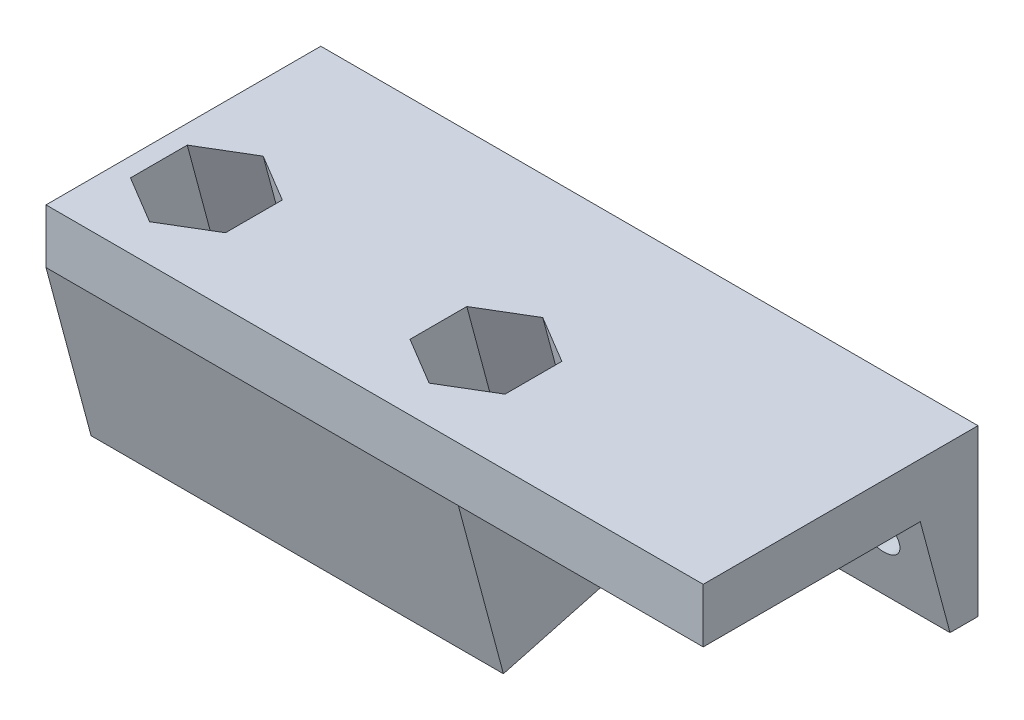
ISO-10303-21;
HEADER;
FILE_DESCRIPTION(('STEP AP214'),'2;1');
FILE_NAME('part.step','',(''),(''),'','','');
FILE_SCHEMA(('AUTOMOTIVE_DESIGN { 1 0 10303 214 1 1 1 1 }'));
ENDSEC;
DATA;
#1=APPLICATION_CONTEXT('core data for automotive mechanical design processes');
#2=APPLICATION_PROTOCOL_DEFINITION('international standard','automotive_design',2000,#1);
#3=PRODUCT_CONTEXT('',#1,'mechanical');
#4=PRODUCT('Part','Part','',(#3));
#5=PRODUCT_RELATED_PRODUCT_CATEGORY('part','',(#4));
#6=PRODUCT_DEFINITION_FORMATION('','',#4);
#7=PRODUCT_DEFINITION_CONTEXT('part definition',#1,'design');
#8=PRODUCT_DEFINITION('design','',#6,#7);
#9=PRODUCT_DEFINITION_SHAPE('','',#8);
#10=(LENGTH_UNIT() NAMED_UNIT(*) SI_UNIT(.MILLI.,.METRE.));
#11=(NAMED_UNIT(*) PLANE_ANGLE_UNIT() SI_UNIT($,.RADIAN.));
#12=(NAMED_UNIT(*) SI_UNIT($,.STERADIAN.) SOLID_ANGLE_UNIT());
#13=UNCERTAINTY_MEASURE_WITH_UNIT(LENGTH_MEASURE(1.E-05),#10,'distance_accuracy_value','');
#14=(GEOMETRIC_REPRESENTATION_CONTEXT(3) GLOBAL_UNCERTAINTY_ASSIGNED_CONTEXT((#13)) GLOBAL_UNIT_ASSIGNED_CONTEXT((#10,
#11,#12)) REPRESENTATION_CONTEXT('',''));
#15=CARTESIAN_POINT('',(0.,0.,0.));
#16=DIRECTION('',(0.,0.,1.));
#17=DIRECTION('',(1.,0.,0.));
#18=AXIS2_PLACEMENT_3D('',#15,#16,#17);
#19=CARTESIAN_POINT('',(-34.7500000000001,10.2662464495213,12.2025071457582));
#20=DIRECTION('',(0.,-0.965925826289068,-0.25881904510252));
#21=DIRECTION('',(0.,0.25881904510252,-0.965925826289068));
#22=AXIS2_PLACEMENT_3D('',#19,#20,#21);
#23=CYLINDRICAL_SURFACE('',#22,2.);
#24=CARTESIAN_POINT('',(-34.75,-0.975363448323253,9.190326852005));
#25=DIRECTION('',(0.,0.965925826289068,0.25881904510252));
#26=DIRECTION('',(0.,-0.25881904510252,0.965925826289068));
#27=AXIS2_PLACEMENT_3D('',#24,#25,#26);
#28=CIRCLE('',#27,2.);
#29=CARTESIAN_POINT('',(-34.75,-1.49300153852829,11.1221785045831));
#30=VERTEX_POINT('',#29);
#31=EDGE_CURVE('E381',#30,#30,#28,.T.);
#32=ORIENTED_EDGE('',*,*,#31,.F.);
#33=EDGE_LOOP('',(#32));
#34=FACE_BOUND('',#33,.T.);
#35=CARTESIAN_POINT('',(-34.7500000000001,3.33145055141853,10.3443341851869));
#36=DIRECTION('',(0.,0.965925826289068,0.25881904510252));
#37=DIRECTION('',(0.,-0.25881904510252,0.965925826289068));
#38=AXIS2_PLACEMENT_3D('',#35,#36,#37);
#39=CIRCLE('',#38,2.);
#40=CARTESIAN_POINT('',(-34.7500000000001,2.81381246121349,12.276185837765));
#41=VERTEX_POINT('',#40);
#42=EDGE_CURVE('E317',#41,#41,#39,.T.);
#43=ORIENTED_EDGE('',*,*,#42,.T.);
#44=EDGE_LOOP('',(#43));
#45=FACE_BOUND('',#44,.T.);
#46=ADVANCED_FACE('F39',(#34,#45),#23,.F.);
#47=CARTESIAN_POINT('',(-14.7500000000001,10.2662464495213,12.2025071457582));
#48=DIRECTION('',(0.,-0.965925826289068,-0.25881904510252));
#49=DIRECTION('',(0.,0.25881904510252,-0.965925826289068));
#50=AXIS2_PLACEMENT_3D('',#47,#48,#49);
#51=CYLINDRICAL_SURFACE('',#50,2.);
#52=CARTESIAN_POINT('',(-14.7500000000001,-0.975363448323243,9.190326852005));
#53=DIRECTION('',(0.,0.965925826289068,0.25881904510252));
#54=DIRECTION('',(0.,-0.25881904510252,0.965925826289068));
#55=AXIS2_PLACEMENT_3D('',#52,#53,#54);
#56=CIRCLE('',#55,2.);
#57=CARTESIAN_POINT('',(-14.7500000000001,-1.49300153852828,11.1221785045831));
#58=VERTEX_POINT('',#57);
#59=EDGE_CURVE('E384',#58,#58,#56,.T.);
#60=ORIENTED_EDGE('',*,*,#59,.F.);
#61=EDGE_LOOP('',(#60));
#62=FACE_BOUND('',#61,.T.);
#63=CARTESIAN_POINT('',(-14.7500000000001,3.33145055141854,10.3443341851869));
#64=DIRECTION('',(0.,0.965925826289068,0.25881904510252));
#65=DIRECTION('',(0.,-0.25881904510252,0.965925826289068));
#66=AXIS2_PLACEMENT_3D('',#63,#64,#65);
#67=CIRCLE('',#66,2.);
#68=CARTESIAN_POINT('',(-14.7500000000001,2.8138124612135,12.276185837765));
#69=VERTEX_POINT('',#68);
#70=EDGE_CURVE('E305',#69,#69,#67,.T.);
#71=ORIENTED_EDGE('',*,*,#70,.T.);
#72=EDGE_LOOP('',(#71));
#73=FACE_BOUND('',#72,.T.);
#74=ADVANCED_FACE('F537',(#62,#73),#51,.F.);
#75=CARTESIAN_POINT('',(-10.,12.2073892877902,4.95806344859015));
#76=DIRECTION('',(0.,-0.25881904510252,0.965925826289068));
#77=DIRECTION('',(0.,-0.965925826289068,-0.25881904510252));
#78=AXIS2_PLACEMENT_3D('',#75,#76,#77);
#79=PLANE('',#78);
#80=CARTESIAN_POINT('',(3.74999999999994,6.27312353150435,3.36798173152168));
#81=DIRECTION('',(0.,-0.25881904510252,0.965925826289068));
#82=DIRECTION('',(0.,0.965925826289068,0.25881904510252));
#83=AXIS2_PLACEMENT_3D('',#80,#81,#82);
#84=ELLIPSE('',#83,1.55291427061512,1.5);
#85=CARTESIAN_POINT('',(3.74999999999994,7.77312353150435,3.76990552016836));
#86=VERTEX_POINT('',#85);
#87=EDGE_CURVE('E230',#86,#86,#84,.T.);
#88=ORIENTED_EDGE('',*,*,#87,.F.);
#89=EDGE_LOOP('',(#88));
#90=FACE_BOUND('',#89,.T.);
#91=DIRECTION('',(0.,-0.965925826289068,-0.25881904510252));
#92=VECTOR('',#91,1.);
#93=CARTESIAN_POINT('',(7.51920912370846,-0.421775836808597,1.5740888523746));
#94=LINE('',#93,#92);
#95=CARTESIAN_POINT('',(7.51920912370846,9.11771432346218,4.13018753702379));
#96=VERTEX_POINT('',#95);
#97=CARTESIAN_POINT('',(7.51920912370846,1.17463517425132,2.00184589357625));
#98=VERTEX_POINT('',#97);
#99=EDGE_CURVE('E334',#96,#98,#94,.T.);
#100=ORIENTED_EDGE('',*,*,#99,.F.);
#101=DIRECTION('',(-1.,0.,0.));
#102=VECTOR('',#101,1.);
#103=CARTESIAN_POINT('',(23.5262830368964,9.11771432346221,4.1301875370238));
#104=LINE('',#103,#102);
#105=CARTESIAN_POINT('',(-10.,9.11771432346219,4.13018753702379));
#106=VERTEX_POINT('',#105);
#107=EDGE_CURVE('E319',#96,#106,#104,.T.);
#108=ORIENTED_EDGE('',*,*,#107,.T.);
#109=DIRECTION('',(0.,-0.965925826289068,-0.25881904510252));
#110=VECTOR('',#109,1.);
#111=CARTESIAN_POINT('',(-10.,12.2073892877902,4.95806344859015));
#112=LINE('',#111,#110);
#113=CARTESIAN_POINT('',(-10.,1.16774620563937,2.));
#114=VERTEX_POINT('',#113);
#115=EDGE_CURVE('E406',#106,#114,#112,.T.);
#116=ORIENTED_EDGE('',*,*,#115,.T.);
#117=DIRECTION('',(1.,0.,0.));
#118=VECTOR('',#117,1.);
#119=CARTESIAN_POINT('',(0.,1.16774620563937,2.));
#120=LINE('',#119,#118);
#121=CARTESIAN_POINT('',(0.,1.16774620563937,2.));
#122=VERTEX_POINT('',#121);
#123=EDGE_CURVE('E422',#114,#122,#120,.T.);
#124=ORIENTED_EDGE('',*,*,#123,.T.);
#125=DIRECTION('',(0.,0.965925826289068,0.25881904510252));
#126=VECTOR('',#125,1.);
#127=CARTESIAN_POINT('',(-5.99684705083167E-13,14.5521810124452,5.58634849763062));
#128=LINE('',#127,#126);
#129=CARTESIAN_POINT('',(0.,1.17463517425132,2.00184589357625));
#130=VERTEX_POINT('',#129);
#131=EDGE_CURVE('E409',#122,#130,#128,.T.);
#132=ORIENTED_EDGE('',*,*,#131,.T.);
#133=DIRECTION('',(-1.,0.,0.));
#134=VECTOR('',#133,1.);
#135=CARTESIAN_POINT('',(7.51920912370846,1.17463517425132,2.00184589357625));
#136=LINE('',#135,#134);
#137=EDGE_CURVE('E331',#98,#130,#136,.T.);
#138=ORIENTED_EDGE('',*,*,#137,.F.);
#139=EDGE_LOOP('',(#100,#108,#116,#124,#132,#138));
#140=FACE_BOUND('',#139,.T.);
#141=ADVANCED_FACE('F535',(#90,#140),#79,.T.);
#142=CARTESIAN_POINT('',(-10.,12.2073892877902,4.95806344859015));
#143=DIRECTION('',(-1.,0.,0.));
#144=DIRECTION('',(0.,-1.,0.));
#145=AXIS2_PLACEMENT_3D('',#142,#143,#144);
#146=PLANE('',#145);
#147=DIRECTION('',(0.,0.,-1.));
#148=VECTOR('',#147,1.);
#149=CARTESIAN_POINT('',(-10.,9.11771432346219,4.95806344859015));
#150=LINE('',#149,#148);
#151=CARTESIAN_POINT('',(-10.,9.11771432346219,19.659330243175));
#152=VERTEX_POINT('',#151);
#153=EDGE_CURVE('E313',#152,#106,#150,.T.);
#154=ORIENTED_EDGE('',*,*,#153,.F.);
#155=DIRECTION('',(0.,-0.965925826289068,-0.25881904510252));
#156=VECTOR('',#155,1.);
#157=CARTESIAN_POINT('',(-10.,8.32510361125244,19.4469508429262));
#158=LINE('',#157,#156);
#159=CARTESIAN_POINT('',(-10.,-2.91650628659214,16.434770549173));
#160=VERTEX_POINT('',#159);
#161=EDGE_CURVE('E396',#152,#160,#158,.T.);
#162=ORIENTED_EDGE('',*,*,#161,.T.);
#163=DIRECTION('',(0.,0.25881904510252,-0.965925826289068));
#164=VECTOR('',#163,1.);
#165=CARTESIAN_POINT('',(-10.,0.965779389945662,1.94588315483698));
#166=LINE('',#165,#164);
#167=CARTESIAN_POINT('',(-10.,0.965779389945662,1.94588315483698));
#168=VERTEX_POINT('',#167);
#169=EDGE_CURVE('E387',#160,#168,#166,.T.);
#170=ORIENTED_EDGE('',*,*,#169,.T.);
#171=EDGE_CURVE('E405',#114,#168,#112,.T.);
#172=ORIENTED_EDGE('',*,*,#171,.F.);
#173=ORIENTED_EDGE('',*,*,#115,.F.);
#174=EDGE_LOOP('',(#154,#162,#170,#172,#173));
#175=FACE_BOUND('',#174,.T.);
#176=ADVANCED_FACE('F528',(#175),#146,.F.);
#177=CARTESIAN_POINT('',(3.74999999999994,6.27312353150435,0.));
#178=DIRECTION('',(0.,0.,-1.));
#179=DIRECTION('',(-1.,0.,0.));
#180=AXIS2_PLACEMENT_3D('',#177,#178,#179);
#181=PLANE('',#180);
#182=CARTESIAN_POINT('',(3.74999999999994,6.27312353150435,0.));
#183=DIRECTION('',(0.,0.,-1.));
#184=DIRECTION('',(-1.,0.,0.));
#185=AXIS2_PLACEMENT_3D('',#182,#183,#184);
#186=CIRCLE('',#185,1.5);
#187=CARTESIAN_POINT('',(2.24999999999994,6.27312353150435,0.));
#188=VERTEX_POINT('',#187);
#189=EDGE_CURVE('E43',#188,#188,#186,.T.);
#190=ORIENTED_EDGE('',*,*,#189,.F.);
#191=EDGE_LOOP('',(#190));
#192=FACE_BOUND('',#191,.T.);
#193=DIRECTION('',(0.,-1.,0.));
#194=VECTOR('',#193,1.);
#195=CARTESIAN_POINT('',(-29.5000000000001,1.16774620563936,0.));
#196=LINE('',#195,#194);
#197=CARTESIAN_POINT('',(-29.5000000000001,1.1746351742513,0.));
#198=VERTEX_POINT('',#197);
#199=CARTESIAN_POINT('',(-29.5000000000001,1.16774620563936,0.));
#200=VERTEX_POINT('',#199);
#201=EDGE_CURVE('E425',#198,#200,#196,.T.);
#202=ORIENTED_EDGE('',*,*,#201,.F.);
#203=DIRECTION('',(-1.,0.,0.));
#204=VECTOR('',#203,1.);
#205=CARTESIAN_POINT('',(7.51920912370846,1.17463517425132,0.));
#206=LINE('',#205,#204);
#207=CARTESIAN_POINT('',(-39.5,1.1746351742513,0.));
#208=VERTEX_POINT('',#207);
#209=EDGE_CURVE('E330',#198,#208,#206,.T.);
#210=ORIENTED_EDGE('',*,*,#209,.T.);
#211=DIRECTION('',(0.,-1.,0.));
#212=VECTOR('',#211,1.);
#213=CARTESIAN_POINT('',(-39.5,0.,0.));
#214=LINE('',#213,#212);
#215=CARTESIAN_POINT('',(-39.5000000000001,13.,0.));
#216=VERTEX_POINT('',#215);
#217=EDGE_CURVE('E342',#216,#208,#214,.T.);
#218=ORIENTED_EDGE('',*,*,#217,.F.);
#219=DIRECTION('',(-1.,0.,0.));
#220=VECTOR('',#219,1.);
#221=CARTESIAN_POINT('',(-29.5000000000001,13.,0.));
#222=LINE('',#221,#220);
#223=CARTESIAN_POINT('',(7.51920912370845,13.,0.));
#224=VERTEX_POINT('',#223);
#225=EDGE_CURVE('E418',#224,#216,#222,.T.);
#226=ORIENTED_EDGE('',*,*,#225,.F.);
#227=DIRECTION('',(0.,-1.,0.));
#228=VECTOR('',#227,1.);
#229=CARTESIAN_POINT('',(7.51920912370846,0.,0.));
#230=LINE('',#229,#228);
#231=CARTESIAN_POINT('',(7.51920912370846,1.17463517425132,0.));
#232=VERTEX_POINT('',#231);
#233=EDGE_CURVE('E325',#224,#232,#230,.T.);
#234=ORIENTED_EDGE('',*,*,#233,.T.);
#235=CARTESIAN_POINT('',(0.,1.17463517425132,0.));
#236=VERTEX_POINT('',#235);
#237=EDGE_CURVE('E326',#232,#236,#206,.T.);
#238=ORIENTED_EDGE('',*,*,#237,.T.);
#239=DIRECTION('',(0.,1.,0.));
#240=VECTOR('',#239,1.);
#241=CARTESIAN_POINT('',(0.,2.52312353150435,0.));
#242=LINE('',#241,#240);
#243=CARTESIAN_POINT('',(0.,1.16774620563937,0.));
#244=VERTEX_POINT('',#243);
#245=EDGE_CURVE('E431',#244,#236,#242,.T.);
#246=ORIENTED_EDGE('',*,*,#245,.F.);
#247=DIRECTION('',(1.,0.,0.));
#248=VECTOR('',#247,1.);
#249=CARTESIAN_POINT('',(0.,1.16774620563937,0.));
#250=LINE('',#249,#248);
#251=EDGE_CURVE('E428',#200,#244,#250,.T.);
#252=ORIENTED_EDGE('',*,*,#251,.F.);
#253=EDGE_LOOP('',(#202,#210,#218,#226,#234,#238,#246,#252));
#254=FACE_BOUND('',#253,.T.);
#255=CARTESIAN_POINT('',(-33.2500000000001,6.27312353150437,0.));
#256=DIRECTION('',(0.,0.,1.));
#257=DIRECTION('',(1.,0.,0.));
#258=AXIS2_PLACEMENT_3D('',#255,#256,#257);
#259=CIRCLE('',#258,1.5);
#260=CARTESIAN_POINT('',(-31.7500000000001,6.27312353150437,0.));
#261=VERTEX_POINT('',#260);
#262=EDGE_CURVE('E415',#261,#261,#259,.T.);
#263=ORIENTED_EDGE('',*,*,#262,.T.);
#264=EDGE_LOOP('',(#263));
#265=FACE_BOUND('',#264,.T.);
#266=ADVANCED_FACE('F472',(#192,#254,#265),#181,.T.);
#267=CARTESIAN_POINT('',(-29.5000000000001,13.,2.));
#268=DIRECTION('',(0.,-1.,0.));
#269=DIRECTION('',(1.,0.,0.));
#270=AXIS2_PLACEMENT_3D('',#267,#268,#269);
#271=PLANE('',#270);
#272=DIRECTION('',(0.,0.,1.));
#273=VECTOR('',#272,1.);
#274=CARTESIAN_POINT('',(-11.3500000000001,13.,2.));
#275=LINE('',#274,#273);
#276=CARTESIAN_POINT('',(-11.3500000000001,13.,10.9027764650004));
#277=VERTEX_POINT('',#276);
#278=CARTESIAN_POINT('',(-11.3500000000001,13.,14.9672519388289));
#279=VERTEX_POINT('',#278);
#280=EDGE_CURVE('E287',#277,#279,#275,.T.);
#281=ORIENTED_EDGE('',*,*,#280,.T.);
#282=DIRECTION('',(-0.858356263574049,0.,0.513054114868206));
#283=VECTOR('',#282,1.);
#284=CARTESIAN_POINT('',(-19.0119148019403,13.,19.5469085263362));
#285=LINE('',#284,#283);
#286=CARTESIAN_POINT('',(-14.7500000000001,13.,16.9994896757431));
#287=VERTEX_POINT('',#286);
#288=EDGE_CURVE('E302',#279,#287,#285,.T.);
#289=ORIENTED_EDGE('',*,*,#288,.T.);
#290=DIRECTION('',(-0.858356263574048,0.,-0.513054114868206));
#291=VECTOR('',#290,1.);
#292=CARTESIAN_POINT('',(-32.2229617169554,13.,6.55560374137409));
#293=LINE('',#292,#291);
#294=CARTESIAN_POINT('',(-18.1500000000001,13.,14.9672519388289));
#295=VERTEX_POINT('',#294);
#296=EDGE_CURVE('E299',#287,#295,#293,.T.);
#297=ORIENTED_EDGE('',*,*,#296,.T.);
#298=DIRECTION('',(0.,0.,-1.));
#299=VECTOR('',#298,1.);
#300=CARTESIAN_POINT('',(-18.1500000000001,13.,2.));
#301=LINE('',#300,#299);
#302=CARTESIAN_POINT('',(-18.1500000000001,13.,10.9027764650004));
#303=VERTEX_POINT('',#302);
#304=EDGE_CURVE('E296',#295,#303,#301,.T.);
#305=ORIENTED_EDGE('',*,*,#304,.T.);
#306=DIRECTION('',(0.858356263574049,0.,-0.513054114868206));
#307=VECTOR('',#306,1.);
#308=CARTESIAN_POINT('',(-22.5917683389919,13.,13.5576968288622));
#309=LINE('',#308,#307);
#310=CARTESIAN_POINT('',(-14.7500000000001,13.,8.87053872808612));
#311=VERTEX_POINT('',#310);
#312=EDGE_CURVE('E293',#303,#311,#309,.T.);
#313=ORIENTED_EDGE('',*,*,#312,.T.);
#314=DIRECTION('',(0.858356263574049,0.,0.513054114868206));
#315=VECTOR('',#314,1.);
#316=CARTESIAN_POINT('',(-28.6431081799039,13.,0.566392043900022));
#317=LINE('',#316,#315);
#318=EDGE_CURVE('E290',#311,#277,#317,.T.);
#319=ORIENTED_EDGE('',*,*,#318,.T.);
#320=EDGE_LOOP('',(#281,#289,#297,#305,#313,#319));
#321=FACE_BOUND('',#320,.T.);
#322=DIRECTION('',(0.858356263574049,0.,0.513054114868206));
#323=VECTOR('',#322,1.);
#324=CARTESIAN_POINT('',(-33.9075986755679,13.,9.37405630489131));
#325=LINE('',#324,#323);
#326=CARTESIAN_POINT('',(-34.7500000000001,13.,8.87053872808613));
#327=VERTEX_POINT('',#326);
#328=CARTESIAN_POINT('',(-31.3500000000001,13.,10.9027764650004));
#329=VERTEX_POINT('',#328);
#330=EDGE_CURVE('E253',#327,#329,#325,.T.);
#331=ORIENTED_EDGE('',*,*,#330,.T.);
#332=DIRECTION('',(0.,0.,1.));
#333=VECTOR('',#332,1.);
#334=CARTESIAN_POINT('',(-31.3500000000001,13.,2.));
#335=LINE('',#334,#333);
#336=CARTESIAN_POINT('',(-31.3500000000001,13.,14.9672519388289));
#337=VERTEX_POINT('',#336);
#338=EDGE_CURVE('E284',#329,#337,#335,.T.);
#339=ORIENTED_EDGE('',*,*,#338,.T.);
#340=DIRECTION('',(-0.858356263574049,0.,0.513054114868206));
#341=VECTOR('',#340,1.);
#342=CARTESIAN_POINT('',(-24.2764052976043,13.,10.739244265345));
#343=LINE('',#342,#341);
#344=CARTESIAN_POINT('',(-34.7500000000001,13.,16.9994896757431));
#345=VERTEX_POINT('',#344);
#346=EDGE_CURVE('E281',#337,#345,#343,.T.);
#347=ORIENTED_EDGE('',*,*,#346,.T.);
#348=DIRECTION('',(-0.858356263574048,0.,-0.513054114868207));
#349=VECTOR('',#348,1.);
#350=CARTESIAN_POINT('',(-37.4874522126194,13.,15.3632680023654));
#351=LINE('',#350,#349);
#352=CARTESIAN_POINT('',(-38.1500000000001,13.,14.9672519388289));
#353=VERTEX_POINT('',#352);
#354=EDGE_CURVE('E278',#345,#353,#351,.T.);
#355=ORIENTED_EDGE('',*,*,#354,.T.);
#356=DIRECTION('',(0.,0.,-1.));
#357=VECTOR('',#356,1.);
#358=CARTESIAN_POINT('',(-38.1500000000001,13.,2.));
#359=LINE('',#358,#357);
#360=CARTESIAN_POINT('',(-38.1500000000001,13.,10.9027764650004));
#361=VERTEX_POINT('',#360);
#362=EDGE_CURVE('E275',#353,#361,#359,.T.);
#363=ORIENTED_EDGE('',*,*,#362,.T.);
#364=DIRECTION('',(0.858356263574049,0.,-0.513054114868205));
#365=VECTOR('',#364,1.);
#366=CARTESIAN_POINT('',(-27.8562588346558,13.,4.75003256787089));
#367=LINE('',#366,#365);
#368=EDGE_CURVE('E272',#361,#327,#367,.T.);
#369=ORIENTED_EDGE('',*,*,#368,.T.);
#370=EDGE_LOOP('',(#331,#339,#347,#355,#363,#369));
#371=FACE_BOUND('',#370,.T.);
#372=ORIENTED_EDGE('',*,*,#225,.T.);
#373=DIRECTION('',(0.,0.,-1.));
#374=VECTOR('',#373,1.);
#375=CARTESIAN_POINT('',(-39.5000000000001,13.,0.));
#376=LINE('',#375,#374);
#377=CARTESIAN_POINT('',(-39.5000000000001,13.,19.659330243175));
#378=VERTEX_POINT('',#377);
#379=EDGE_CURVE('E336',#378,#216,#376,.T.);
#380=ORIENTED_EDGE('',*,*,#379,.F.);
#381=DIRECTION('',(-1.,0.,0.));
#382=VECTOR('',#381,1.);
#383=CARTESIAN_POINT('',(23.5262830368964,13.,19.659330243175));
#384=LINE('',#383,#382);
#385=CARTESIAN_POINT('',(7.51920912370846,13.,19.659330243175));
#386=VERTEX_POINT('',#385);
#387=EDGE_CURVE('E316',#386,#378,#384,.T.);
#388=ORIENTED_EDGE('',*,*,#387,.F.);
#389=DIRECTION('',(0.,0.,-1.));
#390=VECTOR('',#389,1.);
#391=CARTESIAN_POINT('',(7.51920912370845,13.,0.));
#392=LINE('',#391,#390);
#393=EDGE_CURVE('E329',#386,#224,#392,.T.);
#394=ORIENTED_EDGE('',*,*,#393,.T.);
#395=EDGE_LOOP('',(#372,#380,#388,#394));
#396=FACE_BOUND('',#395,.T.);
#397=ADVANCED_FACE('F41',(#321,#371,#396),#271,.F.);
#398=CARTESIAN_POINT('',(-29.5000000000001,1.16774620563936,2.));
#399=DIRECTION('',(1.,0.,0.));
#400=DIRECTION('',(0.,0.,-1.));
#401=AXIS2_PLACEMENT_3D('',#398,#399,#400);
#402=PLANE('',#401);
#403=DIRECTION('',(0.,-0.965925826289068,-0.25881904510252));
#404=VECTOR('',#403,1.);
#405=CARTESIAN_POINT('',(-29.5000000000001,13.2875967515564,5.24750416616437));
#406=LINE('',#405,#404);
#407=CARTESIAN_POINT('',(-29.5000000000001,1.1746351742513,2.00184589357625));
#408=VERTEX_POINT('',#407);
#409=CARTESIAN_POINT('',(-29.5000000000001,1.16774620563936,2.));
#410=VERTEX_POINT('',#409);
#411=EDGE_CURVE('E412',#408,#410,#406,.T.);
#412=ORIENTED_EDGE('',*,*,#411,.F.);
#413=DIRECTION('',(0.,0.,-1.));
#414=VECTOR('',#413,1.);
#415=CARTESIAN_POINT('',(-29.5000000000001,1.1746351742513,2.));
#416=LINE('',#415,#414);
#417=EDGE_CURVE('E353',#408,#198,#416,.T.);
#418=ORIENTED_EDGE('',*,*,#417,.T.);
#419=ORIENTED_EDGE('',*,*,#201,.T.);
#420=DIRECTION('',(0.,0.,-1.));
#421=VECTOR('',#420,1.);
#422=CARTESIAN_POINT('',(-29.5000000000001,1.16774620563936,2.));
#423=LINE('',#422,#421);
#424=EDGE_CURVE('E48',#410,#200,#423,.T.);
#425=ORIENTED_EDGE('',*,*,#424,.F.);
#426=EDGE_LOOP('',(#412,#418,#419,#425));
#427=FACE_BOUND('',#426,.T.);
#428=ADVANCED_FACE('F471',(#427),#402,.F.);
#429=CARTESIAN_POINT('',(0.,1.16774620563937,2.));
#430=DIRECTION('',(0.,1.,0.));
#431=DIRECTION('',(-1.,0.,0.));
#432=AXIS2_PLACEMENT_3D('',#429,#430,#431);
#433=PLANE('',#432);
#434=ORIENTED_EDGE('',*,*,#251,.T.);
#435=DIRECTION('',(0.,0.,-1.));
#436=VECTOR('',#435,1.);
#437=CARTESIAN_POINT('',(0.,1.16774620563937,2.));
#438=LINE('',#437,#436);
#439=EDGE_CURVE('E421',#122,#244,#438,.T.);
#440=ORIENTED_EDGE('',*,*,#439,.F.);
#441=ORIENTED_EDGE('',*,*,#123,.F.);
#442=EDGE_CURVE('E419',#410,#114,#120,.T.);
#443=ORIENTED_EDGE('',*,*,#442,.F.);
#444=ORIENTED_EDGE('',*,*,#424,.T.);
#445=EDGE_LOOP('',(#434,#440,#441,#443,#444));
#446=FACE_BOUND('',#445,.T.);
#447=ADVANCED_FACE('F505',(#446),#433,.F.);
#448=CARTESIAN_POINT('',(0.,2.52312353150435,2.));
#449=DIRECTION('',(-1.,0.,0.));
#450=DIRECTION('',(0.,-1.,0.));
#451=AXIS2_PLACEMENT_3D('',#448,#449,#450);
#452=PLANE('',#451);
#453=ORIENTED_EDGE('',*,*,#245,.T.);
#454=DIRECTION('',(0.,0.,1.));
#455=VECTOR('',#454,1.);
#456=CARTESIAN_POINT('',(0.,1.17463517425132,2.));
#457=LINE('',#456,#455);
#458=EDGE_CURVE('E338',#236,#130,#457,.T.);
#459=ORIENTED_EDGE('',*,*,#458,.T.);
#460=ORIENTED_EDGE('',*,*,#131,.F.);
#461=ORIENTED_EDGE('',*,*,#439,.T.);
#462=EDGE_LOOP('',(#453,#459,#460,#461));
#463=FACE_BOUND('',#462,.T.);
#464=ADVANCED_FACE('F501',(#463),#452,.F.);
#465=CARTESIAN_POINT('',(-33.2500000000001,6.27312353150437,2.));
#466=DIRECTION('',(0.,0.,-1.));
#467=DIRECTION('',(-1.,0.,0.));
#468=AXIS2_PLACEMENT_3D('',#465,#466,#467);
#469=CYLINDRICAL_SURFACE('',#468,1.5);
#470=ORIENTED_EDGE('',*,*,#262,.F.);
#471=EDGE_LOOP('',(#470));
#472=FACE_BOUND('',#471,.T.);
#473=CARTESIAN_POINT('',(-33.2500000000001,6.27312353150437,8.));
#474=DIRECTION('',(0.,0.,1.));
#475=DIRECTION('',(1.,0.,0.));
#476=AXIS2_PLACEMENT_3D('',#473,#474,#475);
#477=CIRCLE('',#476,1.5);
#478=CARTESIAN_POINT('',(-32.5875588135233,4.92732574786104,8.));
#479=VERTEX_POINT('',#478);
#480=CARTESIAN_POINT('',(-33.8139592194803,7.66306957317764,8.));
#481=VERTEX_POINT('',#480);
#482=EDGE_CURVE('E217',#479,#481,#477,.T.);
#483=ORIENTED_EDGE('',*,*,#482,.T.);
#484=CARTESIAN_POINT('',(-33.2500000000001,6.27312353150437,7.96465308293685));
#485=DIRECTION('',(0.5,0.224143868042013,-0.836516303737808));
#486=DIRECTION('',(0.763325544034592,0.342189480030375,0.547942034873065));
#487=AXIS2_PLACEMENT_3D('',#484,#485,#486);
#488=ELLIPSE('',#487,1.79315094433611,1.5);
#489=CARTESIAN_POINT('',(-34.7500000000001,6.27312353150436,7.0680776107688));
#490=VERTEX_POINT('',#489);
#491=EDGE_CURVE('E219',#490,#481,#488,.T.);
#492=ORIENTED_EDGE('',*,*,#491,.F.);
#493=EDGE_CURVE('E225',#479,#490,#488,.T.);
#494=ORIENTED_EDGE('',*,*,#493,.F.);
#495=EDGE_LOOP('',(#483,#492,#494));
#496=FACE_BOUND('',#495,.T.);
#497=ADVANCED_FACE('F227',(#472,#496),#469,.F.);
#498=CARTESIAN_POINT('',(-10.,8.32510361125244,19.4469508429262));
#499=DIRECTION('',(0.,0.25881904510252,-0.965925826289068));
#500=DIRECTION('',(0.,0.965925826289068,0.25881904510252));
#501=AXIS2_PLACEMENT_3D('',#498,#499,#500);
#502=PLANE('',#501);
#503=DIRECTION('',(1.,0.,0.));
#504=VECTOR('',#503,1.);
#505=CARTESIAN_POINT('',(-10.,-2.91650628659214,16.434770549173));
#506=LINE('',#505,#504);
#507=CARTESIAN_POINT('',(-39.5,-2.91650628659216,16.434770549173));
#508=VERTEX_POINT('',#507);
#509=EDGE_CURVE('E394',#508,#160,#506,.T.);
#510=ORIENTED_EDGE('',*,*,#509,.T.);
#511=ORIENTED_EDGE('',*,*,#161,.F.);
#512=DIRECTION('',(1.,0.,0.));
#513=VECTOR('',#512,1.);
#514=CARTESIAN_POINT('',(-10.,9.11771432346219,19.659330243175));
#515=LINE('',#514,#513);
#516=CARTESIAN_POINT('',(-39.5000000000001,9.11771432346217,19.659330243175));
#517=VERTEX_POINT('',#516);
#518=EDGE_CURVE('E358',#517,#152,#515,.T.);
#519=ORIENTED_EDGE('',*,*,#518,.F.);
#520=DIRECTION('',(0.,-0.965925826289068,-0.25881904510252));
#521=VECTOR('',#520,1.);
#522=CARTESIAN_POINT('',(-39.5000000000001,8.32510361125243,19.4469508429262));
#523=LINE('',#522,#521);
#524=EDGE_CURVE('E399',#517,#508,#523,.T.);
#525=ORIENTED_EDGE('',*,*,#524,.T.);
#526=EDGE_LOOP('',(#510,#511,#519,#525));
#527=FACE_BOUND('',#526,.T.);
#528=ADVANCED_FACE('F520',(#527),#502,.F.);
#529=CARTESIAN_POINT('',(-39.5000000000001,12.2073892877902,4.95806344859015));
#530=DIRECTION('',(1.,0.,0.));
#531=DIRECTION('',(0.,1.,0.));
#532=AXIS2_PLACEMENT_3D('',#529,#530,#531);
#533=PLANE('',#532);
#534=ORIENTED_EDGE('',*,*,#524,.F.);
#535=DIRECTION('',(0.,1.,0.));
#536=VECTOR('',#535,1.);
#537=CARTESIAN_POINT('',(-39.5,0.,19.659330243175));
#538=LINE('',#537,#536);
#539=EDGE_CURVE('E314',#517,#378,#538,.T.);
#540=ORIENTED_EDGE('',*,*,#539,.T.);
#541=ORIENTED_EDGE('',*,*,#379,.T.);
#542=ORIENTED_EDGE('',*,*,#217,.T.);
#543=DIRECTION('',(0.,0.,1.));
#544=VECTOR('',#543,1.);
#545=CARTESIAN_POINT('',(-39.5,1.1746351742513,0.));
#546=LINE('',#545,#544);
#547=CARTESIAN_POINT('',(-39.5,1.1746351742513,2.00184589357625));
#548=VERTEX_POINT('',#547);
#549=EDGE_CURVE('E339',#208,#548,#546,.T.);
#550=ORIENTED_EDGE('',*,*,#549,.T.);
#551=DIRECTION('',(0.,-0.965925826289068,-0.25881904510252));
#552=VECTOR('',#551,1.);
#553=CARTESIAN_POINT('',(-39.5000000000001,12.2073892877902,4.95806344859015));
#554=LINE('',#553,#552);
#555=CARTESIAN_POINT('',(-39.5,0.965779389945648,1.94588315483698));
#556=VERTEX_POINT('',#555);
#557=EDGE_CURVE('E402',#548,#556,#554,.T.);
#558=ORIENTED_EDGE('',*,*,#557,.T.);
#559=DIRECTION('',(0.,-0.25881904510252,0.965925826289068));
#560=VECTOR('',#559,1.);
#561=CARTESIAN_POINT('',(-39.5,0.965779389945648,1.94588315483698));
#562=LINE('',#561,#560);
#563=EDGE_CURVE('E392',#556,#508,#562,.T.);
#564=ORIENTED_EDGE('',*,*,#563,.T.);
#565=EDGE_LOOP('',(#534,#540,#541,#542,#550,#558,#564));
#566=FACE_BOUND('',#565,.T.);
#567=ADVANCED_FACE('F487',(#566),#533,.F.);
#568=CARTESIAN_POINT('',(0.,1.38755522675427,0.37179430246239));
#569=DIRECTION('',(0.,-0.965925826289068,-0.25881904510252));
#570=DIRECTION('',(0.,0.25881904510252,-0.965925826289068));
#571=AXIS2_PLACEMENT_3D('',#568,#569,#570);
#572=PLANE('',#571);
#573=ORIENTED_EDGE('',*,*,#59,.T.);
#574=EDGE_LOOP('',(#573));
#575=FACE_BOUND('',#574,.T.);
#576=ORIENTED_EDGE('',*,*,#169,.F.);
#577=ORIENTED_EDGE('',*,*,#509,.F.);
#578=ORIENTED_EDGE('',*,*,#563,.F.);
#579=DIRECTION('',(-1.,0.,0.));
#580=VECTOR('',#579,1.);
#581=CARTESIAN_POINT('',(-10.,0.965779389945662,1.94588315483698));
#582=LINE('',#581,#580);
#583=EDGE_CURVE('E390',#168,#556,#582,.T.);
#584=ORIENTED_EDGE('',*,*,#583,.F.);
#585=EDGE_LOOP('',(#576,#577,#578,#584));
#586=FACE_BOUND('',#585,.T.);
#587=ORIENTED_EDGE('',*,*,#31,.T.);
#588=EDGE_LOOP('',(#587));
#589=FACE_BOUND('',#588,.T.);
#590=ADVANCED_FACE('F523',(#575,#586,#589),#572,.T.);
#591=CARTESIAN_POINT('',(-10.,12.2073892877902,4.95806344859015));
#592=DIRECTION('',(0.,-0.25881904510252,0.965925826289068));
#593=DIRECTION('',(0.,-0.965925826289068,-0.25881904510252));
#594=AXIS2_PLACEMENT_3D('',#591,#592,#593);
#595=PLANE('',#594);
#596=ORIENTED_EDGE('',*,*,#557,.F.);
#597=EDGE_CURVE('E335',#408,#548,#136,.T.);
#598=ORIENTED_EDGE('',*,*,#597,.F.);
#599=ORIENTED_EDGE('',*,*,#411,.T.);
#600=ORIENTED_EDGE('',*,*,#442,.T.);
#601=ORIENTED_EDGE('',*,*,#171,.T.);
#602=ORIENTED_EDGE('',*,*,#583,.T.);
#603=EDGE_LOOP('',(#596,#598,#599,#600,#601,#602));
#604=FACE_BOUND('',#603,.T.);
#605=ADVANCED_FACE('F514',(#604),#595,.F.);
#606=CARTESIAN_POINT('',(7.51920912370846,1.17463517425132,0.));
#607=DIRECTION('',(0.,-1.,0.));
#608=DIRECTION('',(1.,0.,0.));
#609=AXIS2_PLACEMENT_3D('',#606,#607,#608);
#610=PLANE('',#609);
#611=ORIENTED_EDGE('',*,*,#417,.F.);
#612=ORIENTED_EDGE('',*,*,#597,.T.);
#613=ORIENTED_EDGE('',*,*,#549,.F.);
#614=ORIENTED_EDGE('',*,*,#209,.F.);
#615=EDGE_LOOP('',(#611,#612,#613,#614));
#616=FACE_BOUND('',#615,.T.);
#617=ADVANCED_FACE('F511',(#616),#610,.T.);
#618=ORIENTED_EDGE('',*,*,#458,.F.);
#619=ORIENTED_EDGE('',*,*,#237,.F.);
#620=DIRECTION('',(0.,0.,1.));
#621=VECTOR('',#620,1.);
#622=CARTESIAN_POINT('',(7.51920912370846,1.17463517425132,0.));
#623=LINE('',#622,#621);
#624=EDGE_CURVE('E346',#232,#98,#623,.T.);
#625=ORIENTED_EDGE('',*,*,#624,.T.);
#626=ORIENTED_EDGE('',*,*,#137,.T.);
#627=EDGE_LOOP('',(#618,#619,#625,#626));
#628=FACE_BOUND('',#627,.T.);
#629=ADVANCED_FACE('F497',(#628),#610,.T.);
#630=CARTESIAN_POINT('',(7.51920912370846,0.,0.));
#631=DIRECTION('',(-1.,0.,0.));
#632=DIRECTION('',(0.,-1.,0.));
#633=AXIS2_PLACEMENT_3D('',#630,#631,#632);
#634=PLANE('',#633);
#635=ORIENTED_EDGE('',*,*,#233,.F.);
#636=ORIENTED_EDGE('',*,*,#393,.F.);
#637=DIRECTION('',(0.,-1.,0.));
#638=VECTOR('',#637,1.);
#639=CARTESIAN_POINT('',(7.51920912370846,0.,19.659330243175));
#640=LINE('',#639,#638);
#641=CARTESIAN_POINT('',(7.51920912370846,9.1177143234622,19.659330243175));
#642=VERTEX_POINT('',#641);
#643=EDGE_CURVE('E309',#386,#642,#640,.T.);
#644=ORIENTED_EDGE('',*,*,#643,.T.);
#645=DIRECTION('',(0.,0.,1.));
#646=VECTOR('',#645,1.);
#647=CARTESIAN_POINT('',(7.51920912370846,9.1177143234622,0.));
#648=LINE('',#647,#646);
#649=EDGE_CURVE('E306',#96,#642,#648,.T.);
#650=ORIENTED_EDGE('',*,*,#649,.F.);
#651=ORIENTED_EDGE('',*,*,#99,.T.);
#652=ORIENTED_EDGE('',*,*,#624,.F.);
#653=EDGE_LOOP('',(#635,#636,#644,#650,#651,#652));
#654=FACE_BOUND('',#653,.T.);
#655=ADVANCED_FACE('F492',(#654),#634,.F.);
#656=CARTESIAN_POINT('',(23.5262830368964,0.,19.659330243175));
#657=DIRECTION('',(0.,0.,1.));
#658=DIRECTION('',(1.,0.,0.));
#659=AXIS2_PLACEMENT_3D('',#656,#657,#658);
#660=PLANE('',#659);
#661=ORIENTED_EDGE('',*,*,#643,.F.);
#662=ORIENTED_EDGE('',*,*,#387,.T.);
#663=ORIENTED_EDGE('',*,*,#539,.F.);
#664=ORIENTED_EDGE('',*,*,#518,.T.);
#665=DIRECTION('',(-1.,0.,0.));
#666=VECTOR('',#665,1.);
#667=CARTESIAN_POINT('',(23.5262830368964,9.1177143234622,19.659330243175));
#668=LINE('',#667,#666);
#669=EDGE_CURVE('E310',#642,#152,#668,.T.);
#670=ORIENTED_EDGE('',*,*,#669,.F.);
#671=EDGE_LOOP('',(#661,#662,#663,#664,#670));
#672=FACE_BOUND('',#671,.T.);
#673=ADVANCED_FACE('F490',(#672),#660,.T.);
#674=CARTESIAN_POINT('',(23.5262830368964,9.11771432346221,0.));
#675=DIRECTION('',(0.,1.,0.));
#676=DIRECTION('',(-1.,0.,0.));
#677=AXIS2_PLACEMENT_3D('',#674,#675,#676);
#678=PLANE('',#677);
#679=ORIENTED_EDGE('',*,*,#669,.T.);
#680=ORIENTED_EDGE('',*,*,#153,.T.);
#681=ORIENTED_EDGE('',*,*,#107,.F.);
#682=ORIENTED_EDGE('',*,*,#649,.T.);
#683=EDGE_LOOP('',(#679,#680,#681,#682));
#684=FACE_BOUND('',#683,.T.);
#685=ADVANCED_FACE('F532',(#684),#678,.F.);
#686=CARTESIAN_POINT('',(0.,5.69436922649606,1.52580163564425));
#687=DIRECTION('',(0.,0.965925826289068,0.25881904510252));
#688=DIRECTION('',(0.,-0.25881904510252,0.965925826289068));
#689=AXIS2_PLACEMENT_3D('',#686,#687,#688);
#690=PLANE('',#689);
#691=ORIENTED_EDGE('',*,*,#70,.F.);
#692=EDGE_LOOP('',(#691));
#693=FACE_BOUND('',#692,.T.);
#694=DIRECTION('',(0.866025403784439,0.129409522551261,-0.482962913144534));
#695=VECTOR('',#694,1.);
#696=CARTESIAN_POINT('',(-14.7500000000001,2.31533168296142,14.1365414287983));
#697=LINE('',#696,#695);
#698=CARTESIAN_POINT('',(-14.7500000000001,2.31533168296142,14.1365414287983));
#699=VERTEX_POINT('',#698);
#700=CARTESIAN_POINT('',(-11.35,2.82339111718998,12.2404378069926));
#701=VERTEX_POINT('',#700);
#702=EDGE_CURVE('E234',#699,#701,#697,.T.);
#703=ORIENTED_EDGE('',*,*,#702,.T.);
#704=DIRECTION('',(0.,0.25881904510252,-0.965925826289068));
#705=VECTOR('',#704,1.);
#706=CARTESIAN_POINT('',(-11.35,2.82339111718998,12.2404378069926));
#707=LINE('',#706,#705);
#708=CARTESIAN_POINT('',(-11.35,3.83950998564711,8.44823056338116));
#709=VERTEX_POINT('',#708);
#710=EDGE_CURVE('E237',#701,#709,#707,.T.);
#711=ORIENTED_EDGE('',*,*,#710,.T.);
#712=DIRECTION('',(-0.866025403784439,0.12940952255126,-0.482962913144534));
#713=VECTOR('',#712,1.);
#714=CARTESIAN_POINT('',(-11.35,3.83950998564711,8.44823056338116));
#715=LINE('',#714,#713);
#716=CARTESIAN_POINT('',(-14.7500000000001,4.34756941987567,6.55212694157546));
#717=VERTEX_POINT('',#716);
#718=EDGE_CURVE('E241',#709,#717,#715,.T.);
#719=ORIENTED_EDGE('',*,*,#718,.T.);
#720=DIRECTION('',(-0.866025403784439,-0.129409522551261,0.482962913144534));
#721=VECTOR('',#720,1.);
#722=CARTESIAN_POINT('',(-14.7500000000001,4.34756941987567,6.55212694157546));
#723=LINE('',#722,#721);
#724=CARTESIAN_POINT('',(-18.1500000000001,3.83950998564711,8.44823056338116));
#725=VERTEX_POINT('',#724);
#726=EDGE_CURVE('E244',#717,#725,#723,.T.);
#727=ORIENTED_EDGE('',*,*,#726,.T.);
#728=DIRECTION('',(0.,-0.25881904510252,0.965925826289068));
#729=VECTOR('',#728,1.);
#730=CARTESIAN_POINT('',(-18.1500000000001,3.83950998564711,8.44823056338116));
#731=LINE('',#730,#729);
#732=CARTESIAN_POINT('',(-18.1500000000001,2.82339111718998,12.2404378069926));
#733=VERTEX_POINT('',#732);
#734=EDGE_CURVE('E247',#725,#733,#731,.T.);
#735=ORIENTED_EDGE('',*,*,#734,.T.);
#736=DIRECTION('',(0.866025403784438,-0.12940952255126,0.482962913144535));
#737=VECTOR('',#736,1.);
#738=CARTESIAN_POINT('',(-18.1500000000001,2.82339111718998,12.2404378069926));
#739=LINE('',#738,#737);
#740=EDGE_CURVE('E250',#733,#699,#739,.T.);
#741=ORIENTED_EDGE('',*,*,#740,.T.);
#742=EDGE_LOOP('',(#703,#711,#719,#727,#735,#741));
#743=FACE_BOUND('',#742,.T.);
#744=ADVANCED_FACE('F445',(#693,#743),#690,.T.);
#745=CARTESIAN_POINT('',(0.,5.69436922649604,1.52580163564425));
#746=DIRECTION('',(0.,0.965925826289068,0.25881904510252));
#747=DIRECTION('',(0.,-0.25881904510252,0.965925826289068));
#748=AXIS2_PLACEMENT_3D('',#745,#746,#747);
#749=PLANE('',#748);
#750=ORIENTED_EDGE('',*,*,#42,.F.);
#751=EDGE_LOOP('',(#750));
#752=FACE_BOUND('',#751,.T.);
#753=DIRECTION('',(0.,0.25881904510252,-0.965925826289068));
#754=VECTOR('',#753,1.);
#755=CARTESIAN_POINT('',(-31.3500000000001,2.82339111718998,12.2404378069925));
#756=LINE('',#755,#754);
#757=CARTESIAN_POINT('',(-31.3500000000001,2.82339111718998,12.2404378069925));
#758=VERTEX_POINT('',#757);
#759=CARTESIAN_POINT('',(-31.3500000000001,3.8395099856471,8.44823056338116));
#760=VERTEX_POINT('',#759);
#761=EDGE_CURVE('E233',#758,#760,#756,.T.);
#762=ORIENTED_EDGE('',*,*,#761,.T.);
#763=DIRECTION('',(-0.866025403784439,0.12940952255126,-0.482962913144534));
#764=VECTOR('',#763,1.);
#765=CARTESIAN_POINT('',(-31.3500000000001,3.8395099856471,8.44823056338116));
#766=LINE('',#765,#764);
#767=CARTESIAN_POINT('',(-34.75,4.34756941987566,6.55212694157546));
#768=VERTEX_POINT('',#767);
#769=EDGE_CURVE('E256',#760,#768,#766,.T.);
#770=ORIENTED_EDGE('',*,*,#769,.T.);
#771=DIRECTION('',(-0.866025403784439,-0.129409522551261,0.482962913144534));
#772=VECTOR('',#771,1.);
#773=CARTESIAN_POINT('',(-34.75,4.34756941987566,6.55212694157546));
#774=LINE('',#773,#772);
#775=CARTESIAN_POINT('',(-38.1500000000001,3.8395099856471,8.44823056338116));
#776=VERTEX_POINT('',#775);
#777=EDGE_CURVE('E259',#768,#776,#774,.T.);
#778=ORIENTED_EDGE('',*,*,#777,.T.);
#779=DIRECTION('',(0.,-0.258819045102521,0.965925826289068));
#780=VECTOR('',#779,1.);
#781=CARTESIAN_POINT('',(-38.1500000000001,3.8395099856471,8.44823056338116));
#782=LINE('',#781,#780);
#783=CARTESIAN_POINT('',(-38.1500000000001,2.82339111718997,12.2404378069925));
#784=VERTEX_POINT('',#783);
#785=EDGE_CURVE('E262',#776,#784,#782,.T.);
#786=ORIENTED_EDGE('',*,*,#785,.T.);
#787=DIRECTION('',(0.866025403784438,-0.129409522551259,0.482962913144535));
#788=VECTOR('',#787,1.);
#789=CARTESIAN_POINT('',(-38.1500000000001,2.82339111718997,12.2404378069925));
#790=LINE('',#789,#788);
#791=CARTESIAN_POINT('',(-34.7500000000001,2.31533168296141,14.1365414287982));
#792=VERTEX_POINT('',#791);
#793=EDGE_CURVE('E265',#784,#792,#790,.T.);
#794=ORIENTED_EDGE('',*,*,#793,.T.);
#795=DIRECTION('',(0.866025403784439,0.12940952255126,-0.482962913144534));
#796=VECTOR('',#795,1.);
#797=CARTESIAN_POINT('',(-34.7500000000001,2.31533168296141,14.1365414287982));
#798=LINE('',#797,#796);
#799=EDGE_CURVE('E238',#792,#758,#798,.T.);
#800=ORIENTED_EDGE('',*,*,#799,.T.);
#801=EDGE_LOOP('',(#762,#770,#778,#786,#794,#800));
#802=FACE_BOUND('',#801,.T.);
#803=ADVANCED_FACE('F442',(#752,#802),#749,.T.);
#804=CARTESIAN_POINT('',(-31.3500000000001,7.70321329080337,9.48350674379124));
#805=DIRECTION('',(0.5,0.224143868042013,-0.836516303737808));
#806=DIRECTION('',(-0.858356263574049,0.,-0.513054114868206));
#807=AXIS2_PLACEMENT_3D('',#804,#805,#806);
#808=PLANE('',#807);
#809=DIRECTION('',(0.409064926172233,-0.912505280081001,0.));
#810=VECTOR('',#809,1.);
#811=CARTESIAN_POINT('',(-33.4166393892299,6.77676419770344,8.));
#812=LINE('',#811,#810);
#813=EDGE_CURVE('E11',#481,#479,#812,.T.);
#814=ORIENTED_EDGE('',*,*,#813,.T.);
#815=ORIENTED_EDGE('',*,*,#493,.T.);
#816=DIRECTION('',(0.,0.965925826289068,0.25881904510252));
#817=VECTOR('',#816,1.);
#818=CARTESIAN_POINT('',(-34.7500000000001,8.21127272503194,7.58740312198554));
#819=LINE('',#818,#817);
#820=EDGE_CURVE('E376',#768,#490,#819,.T.);
#821=ORIENTED_EDGE('',*,*,#820,.F.);
#822=ORIENTED_EDGE('',*,*,#769,.F.);
#823=DIRECTION('',(0.,0.965925826289068,0.25881904510252));
#824=VECTOR('',#823,1.);
#825=CARTESIAN_POINT('',(-31.3500000000001,7.70321329080337,9.48350674379124));
#826=LINE('',#825,#824);
#827=EDGE_CURVE('E355',#760,#329,#826,.T.);
#828=ORIENTED_EDGE('',*,*,#827,.T.);
#829=ORIENTED_EDGE('',*,*,#330,.F.);
#830=EDGE_CURVE('E222',#490,#327,#819,.T.);
#831=ORIENTED_EDGE('',*,*,#830,.F.);
#832=ORIENTED_EDGE('',*,*,#491,.T.);
#833=EDGE_LOOP('',(#814,#815,#821,#822,#828,#829,#831,#832));
#834=FACE_BOUND('',#833,.T.);
#835=ADVANCED_FACE('F220',(#834),#808,.F.);
#836=CARTESIAN_POINT('',(-34.7500000000001,8.21127272503194,7.58740312198554));
#837=DIRECTION('',(-0.5,0.224143868042013,-0.836516303737808));
#838=DIRECTION('',(-0.858356263574049,0.,0.513054114868205));
#839=AXIS2_PLACEMENT_3D('',#836,#837,#838);
#840=PLANE('',#839);
#841=ORIENTED_EDGE('',*,*,#820,.T.);
#842=ORIENTED_EDGE('',*,*,#830,.T.);
#843=ORIENTED_EDGE('',*,*,#368,.F.);
#844=DIRECTION('',(0.,0.965925826289068,0.25881904510252));
#845=VECTOR('',#844,1.);
#846=CARTESIAN_POINT('',(-38.1500000000001,7.70321329080337,9.48350674379124));
#847=LINE('',#846,#845);
#848=EDGE_CURVE('E374',#776,#361,#847,.T.);
#849=ORIENTED_EDGE('',*,*,#848,.F.);
#850=ORIENTED_EDGE('',*,*,#777,.F.);
#851=EDGE_LOOP('',(#841,#842,#843,#849,#850));
#852=FACE_BOUND('',#851,.T.);
#853=ADVANCED_FACE('F456',(#852),#840,.F.);
#854=CARTESIAN_POINT('',(-38.1500000000001,7.70321329080337,9.48350674379124));
#855=DIRECTION('',(-1.,0.,0.));
#856=DIRECTION('',(0.,-1.,0.));
#857=AXIS2_PLACEMENT_3D('',#854,#855,#856);
#858=PLANE('',#857);
#859=ORIENTED_EDGE('',*,*,#848,.T.);
#860=ORIENTED_EDGE('',*,*,#362,.F.);
#861=DIRECTION('',(0.,0.965925826289068,0.25881904510252));
#862=VECTOR('',#861,1.);
#863=CARTESIAN_POINT('',(-38.1500000000001,6.68709442234625,13.2757139874026));
#864=LINE('',#863,#862);
#865=EDGE_CURVE('E372',#784,#353,#864,.T.);
#866=ORIENTED_EDGE('',*,*,#865,.F.);
#867=ORIENTED_EDGE('',*,*,#785,.F.);
#868=EDGE_LOOP('',(#859,#860,#866,#867));
#869=FACE_BOUND('',#868,.T.);
#870=ADVANCED_FACE('F461',(#869),#858,.F.);
#871=CARTESIAN_POINT('',(-38.1500000000001,6.68709442234625,13.2757139874026));
#872=DIRECTION('',(-0.500000000000001,-0.224143868042013,0.836516303737808));
#873=DIRECTION('',(0.858356263574048,0.,0.513054114868207));
#874=AXIS2_PLACEMENT_3D('',#871,#872,#873);
#875=PLANE('',#874);
#876=ORIENTED_EDGE('',*,*,#865,.T.);
#877=ORIENTED_EDGE('',*,*,#354,.F.);
#878=DIRECTION('',(0.,0.965925826289068,0.25881904510252));
#879=VECTOR('',#878,1.);
#880=CARTESIAN_POINT('',(-34.7500000000001,6.17903498811769,15.1718176092083));
#881=LINE('',#880,#879);
#882=EDGE_CURVE('E370',#792,#345,#881,.T.);
#883=ORIENTED_EDGE('',*,*,#882,.F.);
#884=ORIENTED_EDGE('',*,*,#793,.F.);
#885=EDGE_LOOP('',(#876,#877,#883,#884));
#886=FACE_BOUND('',#885,.T.);
#887=ADVANCED_FACE('F465',(#886),#875,.F.);
#888=CARTESIAN_POINT('',(-34.7500000000001,6.17903498811769,15.1718176092083));
#889=DIRECTION('',(0.5,-0.224143868042013,0.836516303737808));
#890=DIRECTION('',(0.858356263574049,0.,-0.513054114868206));
#891=AXIS2_PLACEMENT_3D('',#888,#889,#890);
#892=PLANE('',#891);
#893=ORIENTED_EDGE('',*,*,#882,.T.);
#894=ORIENTED_EDGE('',*,*,#346,.F.);
#895=DIRECTION('',(0.,0.965925826289068,0.25881904510252));
#896=VECTOR('',#895,1.);
#897=CARTESIAN_POINT('',(-31.3500000000001,6.68709442234625,13.2757139874026));
#898=LINE('',#897,#896);
#899=EDGE_CURVE('E368',#758,#337,#898,.T.);
#900=ORIENTED_EDGE('',*,*,#899,.F.);
#901=ORIENTED_EDGE('',*,*,#799,.F.);
#902=EDGE_LOOP('',(#893,#894,#900,#901));
#903=FACE_BOUND('',#902,.T.);
#904=ADVANCED_FACE('F467',(#903),#892,.F.);
#905=CARTESIAN_POINT('',(-31.3500000000001,6.68709442234625,13.2757139874026));
#906=DIRECTION('',(1.,0.,0.));
#907=DIRECTION('',(0.,1.,0.));
#908=AXIS2_PLACEMENT_3D('',#905,#906,#907);
#909=PLANE('',#908);
#910=ORIENTED_EDGE('',*,*,#899,.T.);
#911=ORIENTED_EDGE('',*,*,#338,.F.);
#912=ORIENTED_EDGE('',*,*,#827,.F.);
#913=ORIENTED_EDGE('',*,*,#761,.F.);
#914=EDGE_LOOP('',(#910,#911,#912,#913));
#915=FACE_BOUND('',#914,.T.);
#916=ADVANCED_FACE('F451',(#915),#909,.F.);
#917=CARTESIAN_POINT('',(-11.35,6.68709442234625,13.2757139874026));
#918=DIRECTION('',(1.,0.,0.));
#919=DIRECTION('',(0.,1.,0.));
#920=AXIS2_PLACEMENT_3D('',#917,#918,#919);
#921=PLANE('',#920);
#922=DIRECTION('',(0.,0.965925826289068,0.25881904510252));
#923=VECTOR('',#922,1.);
#924=CARTESIAN_POINT('',(-11.35,6.68709442234625,13.2757139874026));
#925=LINE('',#924,#923);
#926=EDGE_CURVE('E61',#701,#279,#925,.T.);
#927=ORIENTED_EDGE('',*,*,#926,.T.);
#928=ORIENTED_EDGE('',*,*,#280,.F.);
#929=DIRECTION('',(0.,0.965925826289068,0.25881904510252));
#930=VECTOR('',#929,1.);
#931=CARTESIAN_POINT('',(-11.35,7.70321329080338,9.48350674379124));
#932=LINE('',#931,#930);
#933=EDGE_CURVE('E365',#709,#277,#932,.T.);
#934=ORIENTED_EDGE('',*,*,#933,.F.);
#935=ORIENTED_EDGE('',*,*,#710,.F.);
#936=EDGE_LOOP('',(#927,#928,#934,#935));
#937=FACE_BOUND('',#936,.T.);
#938=ADVANCED_FACE('F594',(#937),#921,.F.);
#939=CARTESIAN_POINT('',(-11.35,7.70321329080338,9.48350674379124));
#940=DIRECTION('',(0.5,0.224143868042013,-0.836516303737808));
#941=DIRECTION('',(-0.858356263574049,0.,-0.513054114868206));
#942=AXIS2_PLACEMENT_3D('',#939,#940,#941);
#943=PLANE('',#942);
#944=ORIENTED_EDGE('',*,*,#933,.T.);
#945=ORIENTED_EDGE('',*,*,#318,.F.);
#946=DIRECTION('',(0.,0.965925826289068,0.25881904510252));
#947=VECTOR('',#946,1.);
#948=CARTESIAN_POINT('',(-14.7500000000001,8.21127272503195,7.58740312198554));
#949=LINE('',#948,#947);
#950=EDGE_CURVE('E363',#717,#311,#949,.T.);
#951=ORIENTED_EDGE('',*,*,#950,.F.);
#952=ORIENTED_EDGE('',*,*,#718,.F.);
#953=EDGE_LOOP('',(#944,#945,#951,#952));
#954=FACE_BOUND('',#953,.T.);
#955=ADVANCED_FACE('F590',(#954),#943,.F.);
#956=CARTESIAN_POINT('',(-14.7500000000001,8.21127272503195,7.58740312198554));
#957=DIRECTION('',(-0.5,0.224143868042013,-0.836516303737808));
#958=DIRECTION('',(-0.858356263574049,0.,0.513054114868206));
#959=AXIS2_PLACEMENT_3D('',#956,#957,#958);
#960=PLANE('',#959);
#961=ORIENTED_EDGE('',*,*,#950,.T.);
#962=ORIENTED_EDGE('',*,*,#312,.F.);
#963=DIRECTION('',(0.,0.965925826289068,0.25881904510252));
#964=VECTOR('',#963,1.);
#965=CARTESIAN_POINT('',(-18.1500000000001,7.70321329080338,9.48350674379124));
#966=LINE('',#965,#964);
#967=EDGE_CURVE('E361',#725,#303,#966,.T.);
#968=ORIENTED_EDGE('',*,*,#967,.F.);
#969=ORIENTED_EDGE('',*,*,#726,.F.);
#970=EDGE_LOOP('',(#961,#962,#968,#969));
#971=FACE_BOUND('',#970,.T.);
#972=ADVANCED_FACE('F586',(#971),#960,.F.);
#973=CARTESIAN_POINT('',(-18.1500000000001,7.70321329080338,9.48350674379124));
#974=DIRECTION('',(-1.,0.,0.));
#975=DIRECTION('',(0.,-1.,0.));
#976=AXIS2_PLACEMENT_3D('',#973,#974,#975);
#977=PLANE('',#976);
#978=ORIENTED_EDGE('',*,*,#967,.T.);
#979=ORIENTED_EDGE('',*,*,#304,.F.);
#980=DIRECTION('',(0.,0.965925826289068,0.25881904510252));
#981=VECTOR('',#980,1.);
#982=CARTESIAN_POINT('',(-18.1500000000001,6.68709442234625,13.2757139874026));
#983=LINE('',#982,#981);
#984=EDGE_CURVE('E359',#733,#295,#983,.T.);
#985=ORIENTED_EDGE('',*,*,#984,.F.);
#986=ORIENTED_EDGE('',*,*,#734,.F.);
#987=EDGE_LOOP('',(#978,#979,#985,#986));
#988=FACE_BOUND('',#987,.T.);
#989=ADVANCED_FACE('F582',(#988),#977,.F.);
#990=CARTESIAN_POINT('',(-18.1500000000001,6.68709442234625,13.2757139874026));
#991=DIRECTION('',(-0.5,-0.224143868042013,0.836516303737808));
#992=DIRECTION('',(0.858356263574048,0.,0.513054114868206));
#993=AXIS2_PLACEMENT_3D('',#990,#991,#992);
#994=PLANE('',#993);
#995=ORIENTED_EDGE('',*,*,#984,.T.);
#996=ORIENTED_EDGE('',*,*,#296,.F.);
#997=DIRECTION('',(0.,0.965925826289068,0.25881904510252));
#998=VECTOR('',#997,1.);
#999=CARTESIAN_POINT('',(-14.7500000000001,6.17903498811769,15.1718176092083));
#1000=LINE('',#999,#998);
#1001=EDGE_CURVE('E356',#699,#287,#1000,.T.);
#1002=ORIENTED_EDGE('',*,*,#1001,.F.);
#1003=ORIENTED_EDGE('',*,*,#740,.F.);
#1004=EDGE_LOOP('',(#995,#996,#1002,#1003));
#1005=FACE_BOUND('',#1004,.T.);
#1006=ADVANCED_FACE('F578',(#1005),#994,.F.);
#1007=CARTESIAN_POINT('',(-14.7500000000001,6.17903498811769,15.1718176092083));
#1008=DIRECTION('',(0.5,-0.224143868042013,0.836516303737808));
#1009=DIRECTION('',(0.858356263574049,0.,-0.513054114868206));
#1010=AXIS2_PLACEMENT_3D('',#1007,#1008,#1009);
#1011=PLANE('',#1010);
#1012=ORIENTED_EDGE('',*,*,#1001,.T.);
#1013=ORIENTED_EDGE('',*,*,#288,.F.);
#1014=ORIENTED_EDGE('',*,*,#926,.F.);
#1015=ORIENTED_EDGE('',*,*,#702,.F.);
#1016=EDGE_LOOP('',(#1012,#1013,#1014,#1015));
#1017=FACE_BOUND('',#1016,.T.);
#1018=ADVANCED_FACE('F581',(#1017),#1011,.F.);
#1019=CARTESIAN_POINT('',(0.,0.,8.));
#1020=DIRECTION('',(0.,0.,1.));
#1021=DIRECTION('',(1.,0.,0.));
#1022=AXIS2_PLACEMENT_3D('',#1019,#1020,#1021);
#1023=PLANE('',#1022);
#1024=ORIENTED_EDGE('',*,*,#482,.F.);
#1025=ORIENTED_EDGE('',*,*,#813,.F.);
#1026=EDGE_LOOP('',(#1024,#1025));
#1027=FACE_BOUND('',#1026,.T.);
#1028=ADVANCED_FACE('F215',(#1027),#1023,.F.);
#1029=CARTESIAN_POINT('',(3.74999999999994,6.27312353150435,-1.2E-05));
#1030=DIRECTION('',(0.,0.,1.));
#1031=DIRECTION('',(1.,0.,0.));
#1032=AXIS2_PLACEMENT_3D('',#1029,#1030,#1031);
#1033=CYLINDRICAL_SURFACE('',#1032,1.5);
#1034=ORIENTED_EDGE('',*,*,#87,.T.);
#1035=EDGE_LOOP('',(#1034));
#1036=FACE_BOUND('',#1035,.T.);
#1037=ORIENTED_EDGE('',*,*,#189,.T.);
#1038=EDGE_LOOP('',(#1037));
#1039=FACE_BOUND('',#1038,.T.);
#1040=ADVANCED_FACE('F665',(#1036,#1039),#1033,.F.);
#1041=CLOSED_SHELL('',(#46,#74,#141,#176,#266,#397,#428,#447,#464,#497,#528,#567,#590,#605,#617,
#629,#655,#673,#685,#744,#803,#835,#853,#870,#887,#904,#916,#938,#955,#972,#989,#1006,#1018,
#1028,#1040));
#1042=MANIFOLD_SOLID_BREP('B2',#1041);
#1043=ADVANCED_BREP_SHAPE_REPRESENTATION('',(#18,#1042),#14);
#1044=SHAPE_DEFINITION_REPRESENTATION(#9,#1043);
ENDSEC;
END-ISO-10303-21;
